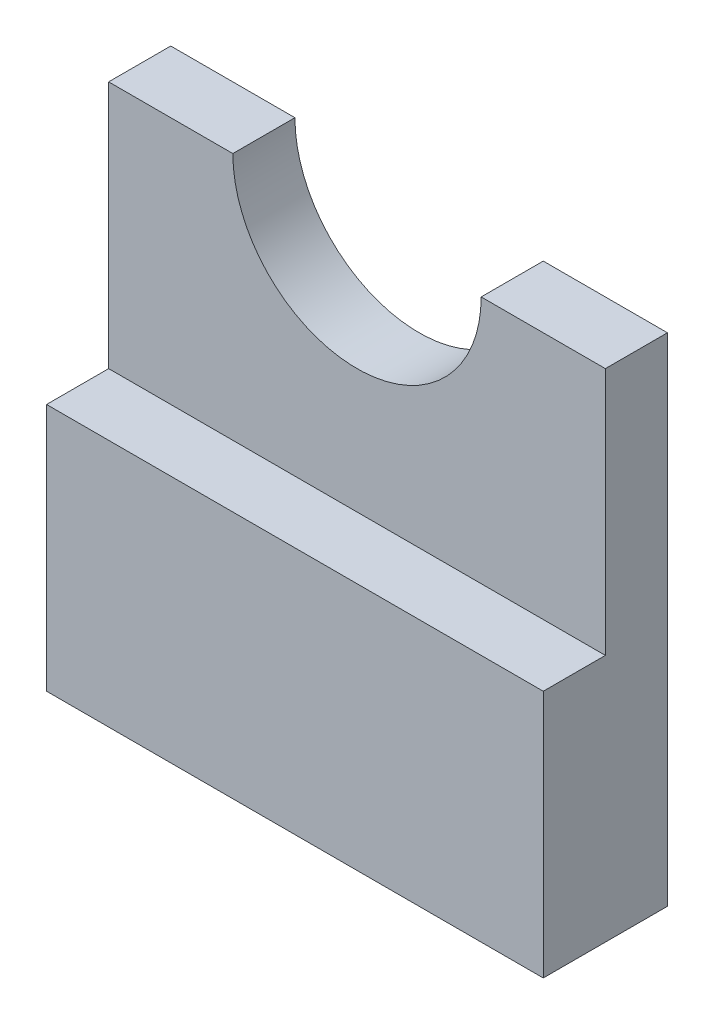
ISO-10303-21;
HEADER;
FILE_DESCRIPTION(('STEP AP214'),'2;1');
FILE_NAME('part.step','',(''),(''),'','','');
FILE_SCHEMA(('AUTOMOTIVE_DESIGN { 1 0 10303 214 1 1 1 1 }'));
ENDSEC;
DATA;
#1=APPLICATION_CONTEXT('core data for automotive mechanical design processes');
#2=APPLICATION_PROTOCOL_DEFINITION('international standard','automotive_design',2000,#1);
#3=PRODUCT_CONTEXT('',#1,'mechanical');
#4=PRODUCT('Part','Part','',(#3));
#5=PRODUCT_RELATED_PRODUCT_CATEGORY('part','',(#4));
#6=PRODUCT_DEFINITION_FORMATION('','',#4);
#7=PRODUCT_DEFINITION_CONTEXT('part definition',#1,'design');
#8=PRODUCT_DEFINITION('design','',#6,#7);
#9=PRODUCT_DEFINITION_SHAPE('','',#8);
#10=(LENGTH_UNIT() NAMED_UNIT(*) SI_UNIT(.MILLI.,.METRE.));
#11=(NAMED_UNIT(*) PLANE_ANGLE_UNIT() SI_UNIT($,.RADIAN.));
#12=(NAMED_UNIT(*) SI_UNIT($,.STERADIAN.) SOLID_ANGLE_UNIT());
#13=UNCERTAINTY_MEASURE_WITH_UNIT(LENGTH_MEASURE(1.E-05),#10,'distance_accuracy_value','');
#14=(GEOMETRIC_REPRESENTATION_CONTEXT(3) GLOBAL_UNCERTAINTY_ASSIGNED_CONTEXT((#13)) GLOBAL_UNIT_ASSIGNED_CONTEXT((#10,
#11,#12)) REPRESENTATION_CONTEXT('',''));
#15=CARTESIAN_POINT('',(0.,0.,0.));
#16=DIRECTION('',(0.,0.,1.));
#17=DIRECTION('',(1.,0.,0.));
#18=AXIS2_PLACEMENT_3D('',#15,#16,#17);
#19=CARTESIAN_POINT('',(25.4,-25.4,3.175));
#20=DIRECTION('',(-1.,0.,0.));
#21=DIRECTION('',(0.,0.,1.));
#22=AXIS2_PLACEMENT_3D('',#19,#20,#21);
#23=PLANE('',#22);
#24=DIRECTION('',(0.,1.,0.));
#25=VECTOR('',#24,1.);
#26=CARTESIAN_POINT('',(25.4,-25.4,-3.175));
#27=LINE('',#26,#25);
#28=CARTESIAN_POINT('',(25.4,-25.4,-3.175));
#29=VERTEX_POINT('',#28);
#30=CARTESIAN_POINT('',(25.4,25.4,-3.175));
#31=VERTEX_POINT('',#30);
#32=EDGE_CURVE('E150',#29,#31,#27,.T.);
#33=ORIENTED_EDGE('',*,*,#32,.T.);
#34=DIRECTION('',(0.,0.,-1.));
#35=VECTOR('',#34,1.);
#36=CARTESIAN_POINT('',(25.4,25.4,3.175));
#37=LINE('',#36,#35);
#38=CARTESIAN_POINT('',(25.4,25.4,3.175));
#39=VERTEX_POINT('',#38);
#40=EDGE_CURVE('E11',#39,#31,#37,.T.);
#41=ORIENTED_EDGE('',*,*,#40,.F.);
#42=DIRECTION('',(0.,1.,0.));
#43=VECTOR('',#42,1.);
#44=CARTESIAN_POINT('',(25.4,-25.4,3.175));
#45=LINE('',#44,#43);
#46=CARTESIAN_POINT('',(25.4,0.,3.175));
#47=VERTEX_POINT('',#46);
#48=EDGE_CURVE('E93',#47,#39,#45,.T.);
#49=ORIENTED_EDGE('',*,*,#48,.F.);
#50=DIRECTION('',(0.,0.,-1.));
#51=VECTOR('',#50,1.);
#52=CARTESIAN_POINT('',(25.4,0.,9.525));
#53=LINE('',#52,#51);
#54=CARTESIAN_POINT('',(25.4,0.,9.525));
#55=VERTEX_POINT('',#54);
#56=EDGE_CURVE('E146',#55,#47,#53,.T.);
#57=ORIENTED_EDGE('',*,*,#56,.F.);
#58=DIRECTION('',(0.,1.,0.));
#59=VECTOR('',#58,1.);
#60=CARTESIAN_POINT('',(25.4,-25.4,9.525));
#61=LINE('',#60,#59);
#62=CARTESIAN_POINT('',(25.4,-25.4,9.525));
#63=VERTEX_POINT('',#62);
#64=EDGE_CURVE('E128',#63,#55,#61,.T.);
#65=ORIENTED_EDGE('',*,*,#64,.F.);
#66=DIRECTION('',(0.,0.,-1.));
#67=VECTOR('',#66,1.);
#68=CARTESIAN_POINT('',(25.4,-25.4,3.175));
#69=LINE('',#68,#67);
#70=EDGE_CURVE('E120',#63,#29,#69,.T.);
#71=ORIENTED_EDGE('',*,*,#70,.T.);
#72=EDGE_LOOP('',(#33,#41,#49,#57,#65,#71));
#73=FACE_BOUND('',#72,.T.);
#74=ADVANCED_FACE('F39',(#73),#23,.F.);
#75=CARTESIAN_POINT('',(12.7,25.4,3.175));
#76=DIRECTION('',(0.,-1.,0.));
#77=DIRECTION('',(0.,0.,-1.));
#78=AXIS2_PLACEMENT_3D('',#75,#76,#77);
#79=PLANE('',#78);
#80=DIRECTION('',(-1.,0.,0.));
#81=VECTOR('',#80,1.);
#82=CARTESIAN_POINT('',(12.7,25.4,-3.175));
#83=LINE('',#82,#81);
#84=CARTESIAN_POINT('',(12.7,25.4,-3.175));
#85=VERTEX_POINT('',#84);
#86=EDGE_CURVE('E167',#31,#85,#83,.T.);
#87=ORIENTED_EDGE('',*,*,#86,.T.);
#88=DIRECTION('',(0.,0.,-1.));
#89=VECTOR('',#88,1.);
#90=CARTESIAN_POINT('',(12.7,25.4,3.175));
#91=LINE('',#90,#89);
#92=CARTESIAN_POINT('',(12.7,25.4,3.175));
#93=VERTEX_POINT('',#92);
#94=EDGE_CURVE('E47',#93,#85,#91,.T.);
#95=ORIENTED_EDGE('',*,*,#94,.F.);
#96=DIRECTION('',(-1.,0.,0.));
#97=VECTOR('',#96,1.);
#98=CARTESIAN_POINT('',(12.7,25.4,3.175));
#99=LINE('',#98,#97);
#100=EDGE_CURVE('E153',#39,#93,#99,.T.);
#101=ORIENTED_EDGE('',*,*,#100,.F.);
#102=ORIENTED_EDGE('',*,*,#40,.T.);
#103=EDGE_LOOP('',(#87,#95,#101,#102));
#104=FACE_BOUND('',#103,.T.);
#105=ADVANCED_FACE('F209',(#104),#79,.F.);
#106=CARTESIAN_POINT('',(0.,25.4,3.175));
#107=DIRECTION('',(0.,0.,-1.));
#108=DIRECTION('',(-1.,0.,0.));
#109=AXIS2_PLACEMENT_3D('',#106,#107,#108);
#110=CYLINDRICAL_SURFACE('',#109,12.7);
#111=CARTESIAN_POINT('',(0.,25.4,-3.175));
#112=DIRECTION('',(0.,0.,-1.));
#113=DIRECTION('',(1.,0.,0.));
#114=AXIS2_PLACEMENT_3D('',#111,#112,#113);
#115=CIRCLE('',#114,12.7);
#116=CARTESIAN_POINT('',(-12.7,25.4,-3.175));
#117=VERTEX_POINT('',#116);
#118=EDGE_CURVE('E170',#85,#117,#115,.T.);
#119=ORIENTED_EDGE('',*,*,#118,.T.);
#120=DIRECTION('',(0.,0.,-1.));
#121=VECTOR('',#120,1.);
#122=CARTESIAN_POINT('',(-12.7,25.4,3.175));
#123=LINE('',#122,#121);
#124=CARTESIAN_POINT('',(-12.7,25.4,3.175));
#125=VERTEX_POINT('',#124);
#126=EDGE_CURVE('E184',#125,#117,#123,.T.);
#127=ORIENTED_EDGE('',*,*,#126,.F.);
#128=CARTESIAN_POINT('',(0.,25.4,3.175));
#129=DIRECTION('',(0.,0.,-1.));
#130=DIRECTION('',(1.,0.,0.));
#131=AXIS2_PLACEMENT_3D('',#128,#129,#130);
#132=CIRCLE('',#131,12.7);
#133=EDGE_CURVE('E156',#93,#125,#132,.T.);
#134=ORIENTED_EDGE('',*,*,#133,.F.);
#135=ORIENTED_EDGE('',*,*,#94,.T.);
#136=EDGE_LOOP('',(#119,#127,#134,#135));
#137=FACE_BOUND('',#136,.T.);
#138=ADVANCED_FACE('F193',(#137),#110,.F.);
#139=CARTESIAN_POINT('',(-25.4,25.4,3.175));
#140=DIRECTION('',(0.,-1.,0.));
#141=DIRECTION('',(0.,0.,-1.));
#142=AXIS2_PLACEMENT_3D('',#139,#140,#141);
#143=PLANE('',#142);
#144=DIRECTION('',(-1.,0.,0.));
#145=VECTOR('',#144,1.);
#146=CARTESIAN_POINT('',(-25.4,25.4,-3.175));
#147=LINE('',#146,#145);
#148=CARTESIAN_POINT('',(-25.4,25.4,-3.175));
#149=VERTEX_POINT('',#148);
#150=EDGE_CURVE('E173',#117,#149,#147,.T.);
#151=ORIENTED_EDGE('',*,*,#150,.T.);
#152=DIRECTION('',(0.,0.,-1.));
#153=VECTOR('',#152,1.);
#154=CARTESIAN_POINT('',(-25.4,25.4,3.175));
#155=LINE('',#154,#153);
#156=CARTESIAN_POINT('',(-25.4,25.4,3.175));
#157=VERTEX_POINT('',#156);
#158=EDGE_CURVE('E119',#157,#149,#155,.T.);
#159=ORIENTED_EDGE('',*,*,#158,.F.);
#160=DIRECTION('',(-1.,0.,0.));
#161=VECTOR('',#160,1.);
#162=CARTESIAN_POINT('',(-25.4,25.4,3.175));
#163=LINE('',#162,#161);
#164=EDGE_CURVE('E61',#125,#157,#163,.T.);
#165=ORIENTED_EDGE('',*,*,#164,.F.);
#166=ORIENTED_EDGE('',*,*,#126,.T.);
#167=EDGE_LOOP('',(#151,#159,#165,#166));
#168=FACE_BOUND('',#167,.T.);
#169=ADVANCED_FACE('F201',(#168),#143,.F.);
#170=CARTESIAN_POINT('',(-25.4,-25.4,3.175));
#171=DIRECTION('',(1.,0.,0.));
#172=DIRECTION('',(0.,0.,-1.));
#173=AXIS2_PLACEMENT_3D('',#170,#171,#172);
#174=PLANE('',#173);
#175=DIRECTION('',(0.,-1.,0.));
#176=VECTOR('',#175,1.);
#177=CARTESIAN_POINT('',(-25.4,-25.4,-3.175));
#178=LINE('',#177,#176);
#179=CARTESIAN_POINT('',(-25.4,-25.4,-3.175));
#180=VERTEX_POINT('',#179);
#181=EDGE_CURVE('E117',#149,#180,#178,.T.);
#182=ORIENTED_EDGE('',*,*,#181,.T.);
#183=DIRECTION('',(0.,0.,-1.));
#184=VECTOR('',#183,1.);
#185=CARTESIAN_POINT('',(-25.4,-25.4,3.175));
#186=LINE('',#185,#184);
#187=CARTESIAN_POINT('',(-25.4,-25.4,9.525));
#188=VERTEX_POINT('',#187);
#189=EDGE_CURVE('E109',#188,#180,#186,.T.);
#190=ORIENTED_EDGE('',*,*,#189,.F.);
#191=DIRECTION('',(0.,-1.,0.));
#192=VECTOR('',#191,1.);
#193=CARTESIAN_POINT('',(-25.4,-25.4,9.525));
#194=LINE('',#193,#192);
#195=CARTESIAN_POINT('',(-25.4,0.,9.525));
#196=VERTEX_POINT('',#195);
#197=EDGE_CURVE('E114',#196,#188,#194,.T.);
#198=ORIENTED_EDGE('',*,*,#197,.F.);
#199=DIRECTION('',(0.,0.,-1.));
#200=VECTOR('',#199,1.);
#201=CARTESIAN_POINT('',(-25.4,0.,9.525));
#202=LINE('',#201,#200);
#203=CARTESIAN_POINT('',(-25.4,0.,3.175));
#204=VERTEX_POINT('',#203);
#205=EDGE_CURVE('E142',#196,#204,#202,.T.);
#206=ORIENTED_EDGE('',*,*,#205,.T.);
#207=DIRECTION('',(0.,-1.,0.));
#208=VECTOR('',#207,1.);
#209=CARTESIAN_POINT('',(-25.4,-25.4,3.175));
#210=LINE('',#209,#208);
#211=EDGE_CURVE('E161',#157,#204,#210,.T.);
#212=ORIENTED_EDGE('',*,*,#211,.F.);
#213=ORIENTED_EDGE('',*,*,#158,.T.);
#214=EDGE_LOOP('',(#182,#190,#198,#206,#212,#213));
#215=FACE_BOUND('',#214,.T.);
#216=ADVANCED_FACE('F111',(#215),#174,.F.);
#217=CARTESIAN_POINT('',(-25.4,-25.4,3.175));
#218=DIRECTION('',(0.,1.,0.));
#219=DIRECTION('',(0.,0.,1.));
#220=AXIS2_PLACEMENT_3D('',#217,#218,#219);
#221=PLANE('',#220);
#222=DIRECTION('',(1.,0.,0.));
#223=VECTOR('',#222,1.);
#224=CARTESIAN_POINT('',(-25.4,-25.4,-3.175));
#225=LINE('',#224,#223);
#226=EDGE_CURVE('E89',#180,#29,#225,.T.);
#227=ORIENTED_EDGE('',*,*,#226,.T.);
#228=ORIENTED_EDGE('',*,*,#70,.F.);
#229=DIRECTION('',(1.,0.,0.));
#230=VECTOR('',#229,1.);
#231=CARTESIAN_POINT('',(-25.4,-25.4,9.525));
#232=LINE('',#231,#230);
#233=EDGE_CURVE('E123',#188,#63,#232,.T.);
#234=ORIENTED_EDGE('',*,*,#233,.F.);
#235=ORIENTED_EDGE('',*,*,#189,.T.);
#236=EDGE_LOOP('',(#227,#228,#234,#235));
#237=FACE_BOUND('',#236,.T.);
#238=ADVANCED_FACE('F124',(#237),#221,.F.);
#239=CARTESIAN_POINT('',(0.,25.4,3.175));
#240=DIRECTION('',(0.,0.,1.));
#241=DIRECTION('',(1.,0.,0.));
#242=AXIS2_PLACEMENT_3D('',#239,#240,#241);
#243=PLANE('',#242);
#244=DIRECTION('',(-1.,0.,0.));
#245=VECTOR('',#244,1.);
#246=CARTESIAN_POINT('',(-25.4,0.,3.175));
#247=LINE('',#246,#245);
#248=EDGE_CURVE('E54',#47,#204,#247,.T.);
#249=ORIENTED_EDGE('',*,*,#248,.F.);
#250=ORIENTED_EDGE('',*,*,#48,.T.);
#251=ORIENTED_EDGE('',*,*,#100,.T.);
#252=ORIENTED_EDGE('',*,*,#133,.T.);
#253=ORIENTED_EDGE('',*,*,#164,.T.);
#254=ORIENTED_EDGE('',*,*,#211,.T.);
#255=EDGE_LOOP('',(#249,#250,#251,#252,#253,#254));
#256=FACE_BOUND('',#255,.T.);
#257=ADVANCED_FACE('F203',(#256),#243,.T.);
#258=CARTESIAN_POINT('',(0.,25.4,-3.175));
#259=DIRECTION('',(0.,0.,1.));
#260=DIRECTION('',(1.,0.,0.));
#261=AXIS2_PLACEMENT_3D('',#258,#259,#260);
#262=PLANE('',#261);
#263=ORIENTED_EDGE('',*,*,#32,.F.);
#264=ORIENTED_EDGE('',*,*,#226,.F.);
#265=ORIENTED_EDGE('',*,*,#181,.F.);
#266=ORIENTED_EDGE('',*,*,#150,.F.);
#267=ORIENTED_EDGE('',*,*,#118,.F.);
#268=ORIENTED_EDGE('',*,*,#86,.F.);
#269=EDGE_LOOP('',(#263,#264,#265,#266,#267,#268));
#270=FACE_BOUND('',#269,.T.);
#271=ADVANCED_FACE('F199',(#270),#262,.F.);
#272=CARTESIAN_POINT('',(-25.4,0.,9.525));
#273=DIRECTION('',(0.,-1.,0.));
#274=DIRECTION('',(0.,0.,-1.));
#275=AXIS2_PLACEMENT_3D('',#272,#273,#274);
#276=PLANE('',#275);
#277=ORIENTED_EDGE('',*,*,#248,.T.);
#278=ORIENTED_EDGE('',*,*,#205,.F.);
#279=DIRECTION('',(-1.,0.,0.));
#280=VECTOR('',#279,1.);
#281=CARTESIAN_POINT('',(-25.4,0.,9.525));
#282=LINE('',#281,#280);
#283=EDGE_CURVE('E132',#55,#196,#282,.T.);
#284=ORIENTED_EDGE('',*,*,#283,.F.);
#285=ORIENTED_EDGE('',*,*,#56,.T.);
#286=EDGE_LOOP('',(#277,#278,#284,#285));
#287=FACE_BOUND('',#286,.T.);
#288=ADVANCED_FACE('F205',(#287),#276,.F.);
#289=CARTESIAN_POINT('',(0.,0.,9.525));
#290=DIRECTION('',(0.,0.,-1.));
#291=DIRECTION('',(-1.,0.,0.));
#292=AXIS2_PLACEMENT_3D('',#289,#290,#291);
#293=PLANE('',#292);
#294=ORIENTED_EDGE('',*,*,#197,.T.);
#295=ORIENTED_EDGE('',*,*,#233,.T.);
#296=ORIENTED_EDGE('',*,*,#64,.T.);
#297=ORIENTED_EDGE('',*,*,#283,.T.);
#298=EDGE_LOOP('',(#294,#295,#296,#297));
#299=FACE_BOUND('',#298,.T.);
#300=ADVANCED_FACE('F130',(#299),#293,.F.);
#301=CLOSED_SHELL('',(#74,#105,#138,#169,#216,#238,#257,#271,#288,#300));
#302=MANIFOLD_SOLID_BREP('B2',#301);
#303=ADVANCED_BREP_SHAPE_REPRESENTATION('',(#18,#302),#14);
#304=SHAPE_DEFINITION_REPRESENTATION(#9,#303);
ENDSEC;
END-ISO-10303-21;
